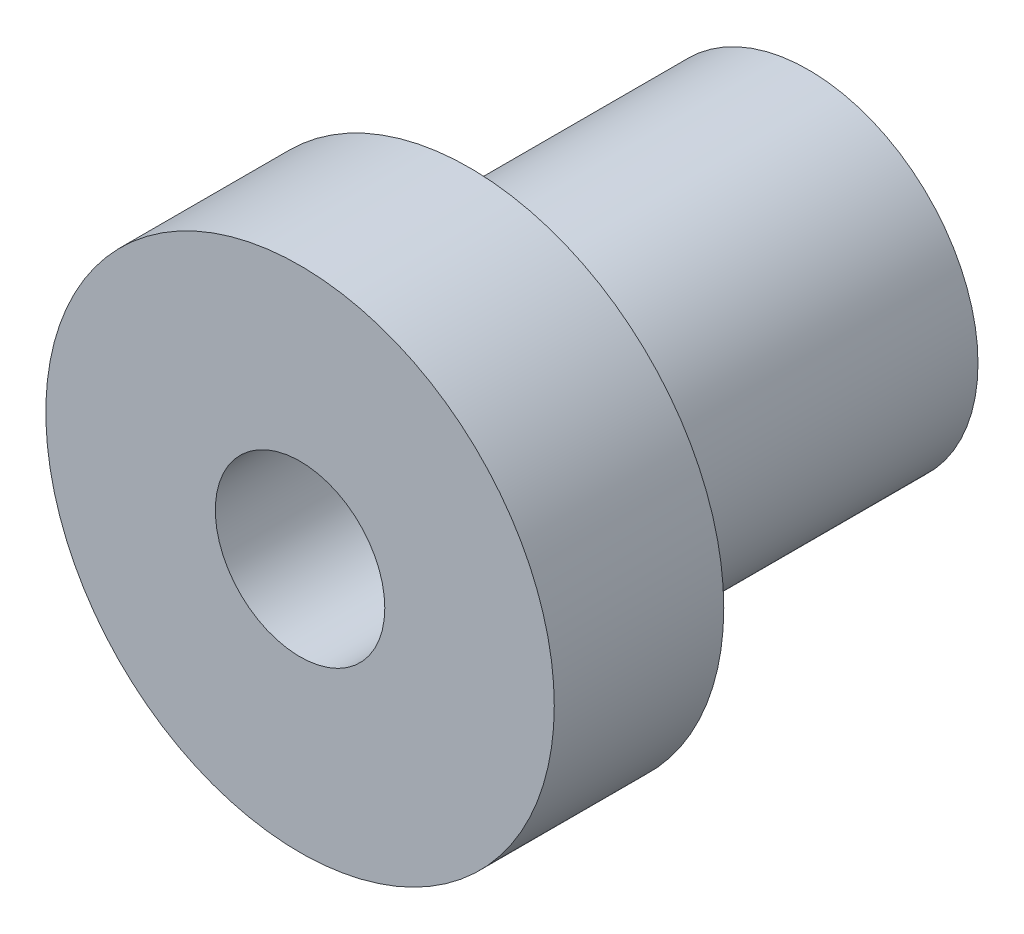
ISO-10303-21;
HEADER;
FILE_DESCRIPTION(('STEP AP214'),'2;1');
FILE_NAME('part.step','',(''),(''),'','','');
FILE_SCHEMA(('AUTOMOTIVE_DESIGN { 1 0 10303 214 1 1 1 1 }'));
ENDSEC;
DATA;
#1=APPLICATION_CONTEXT('core data for automotive mechanical design processes');
#2=APPLICATION_PROTOCOL_DEFINITION('international standard','automotive_design',2000,#1);
#3=PRODUCT_CONTEXT('',#1,'mechanical');
#4=PRODUCT('Part','Part','',(#3));
#5=PRODUCT_RELATED_PRODUCT_CATEGORY('part','',(#4));
#6=PRODUCT_DEFINITION_FORMATION('','',#4);
#7=PRODUCT_DEFINITION_CONTEXT('part definition',#1,'design');
#8=PRODUCT_DEFINITION('design','',#6,#7);
#9=PRODUCT_DEFINITION_SHAPE('','',#8);
#10=(LENGTH_UNIT() NAMED_UNIT(*) SI_UNIT(.MILLI.,.METRE.));
#11=(NAMED_UNIT(*) PLANE_ANGLE_UNIT() SI_UNIT($,.RADIAN.));
#12=(NAMED_UNIT(*) SI_UNIT($,.STERADIAN.) SOLID_ANGLE_UNIT());
#13=UNCERTAINTY_MEASURE_WITH_UNIT(LENGTH_MEASURE(1.E-05),#10,'distance_accuracy_value','');
#14=(GEOMETRIC_REPRESENTATION_CONTEXT(3) GLOBAL_UNCERTAINTY_ASSIGNED_CONTEXT((#13)) GLOBAL_UNIT_ASSIGNED_CONTEXT((#10,
#11,#12)) REPRESENTATION_CONTEXT('',''));
#15=CARTESIAN_POINT('',(0.,0.,0.));
#16=DIRECTION('',(0.,0.,1.));
#17=DIRECTION('',(1.,0.,0.));
#18=AXIS2_PLACEMENT_3D('',#15,#16,#17);
#19=CARTESIAN_POINT('',(0.,4.7625,3.175));
#20=DIRECTION('',(0.,0.,-1.));
#21=DIRECTION('',(-1.,0.,0.));
#22=AXIS2_PLACEMENT_3D('',#19,#20,#21);
#23=PLANE('',#22);
#24=CARTESIAN_POINT('',(0.,0.,3.175));
#25=DIRECTION('',(0.,0.,1.));
#26=DIRECTION('',(1.,0.,0.));
#27=AXIS2_PLACEMENT_3D('',#24,#25,#26);
#28=CIRCLE('',#27,1.5875);
#29=CARTESIAN_POINT('',(1.5875,0.,3.175));
#30=VERTEX_POINT('',#29);
#31=EDGE_CURVE('E10',#30,#30,#28,.T.);
#32=ORIENTED_EDGE('',*,*,#31,.F.);
#33=EDGE_LOOP('',(#32));
#34=FACE_BOUND('',#33,.T.);
#35=CARTESIAN_POINT('',(0.,0.,3.175));
#36=DIRECTION('',(0.,0.,1.));
#37=DIRECTION('',(1.,0.,0.));
#38=AXIS2_PLACEMENT_3D('',#35,#36,#37);
#39=CIRCLE('',#38,4.7625);
#40=CARTESIAN_POINT('',(4.7625,0.,3.175));
#41=VERTEX_POINT('',#40);
#42=EDGE_CURVE('E52',#41,#41,#39,.T.);
#43=ORIENTED_EDGE('',*,*,#42,.T.);
#44=EDGE_LOOP('',(#43));
#45=FACE_BOUND('',#44,.T.);
#46=ADVANCED_FACE('F30',(#34,#45),#23,.F.);
#47=CARTESIAN_POINT('',(0.,0.,3.175));
#48=DIRECTION('',(0.,0.,1.));
#49=DIRECTION('',(1.,0.,0.));
#50=AXIS2_PLACEMENT_3D('',#47,#48,#49);
#51=CYLINDRICAL_SURFACE('',#50,1.5875);
#52=CARTESIAN_POINT('',(0.,0.,-6.35));
#53=DIRECTION('',(0.,0.,1.));
#54=DIRECTION('',(1.,0.,0.));
#55=AXIS2_PLACEMENT_3D('',#52,#53,#54);
#56=CIRCLE('',#55,1.5875);
#57=CARTESIAN_POINT('',(1.5875,0.,-6.35));
#58=VERTEX_POINT('',#57);
#59=EDGE_CURVE('E36',#58,#58,#56,.T.);
#60=ORIENTED_EDGE('',*,*,#59,.F.);
#61=EDGE_LOOP('',(#60));
#62=FACE_BOUND('',#61,.T.);
#63=ORIENTED_EDGE('',*,*,#31,.T.);
#64=EDGE_LOOP('',(#63));
#65=FACE_BOUND('',#64,.T.);
#66=ADVANCED_FACE('F77',(#62,#65),#51,.F.);
#67=CARTESIAN_POINT('',(0.,1.5875,-6.35));
#68=DIRECTION('',(0.,0.,1.));
#69=DIRECTION('',(1.,0.,0.));
#70=AXIS2_PLACEMENT_3D('',#67,#68,#69);
#71=PLANE('',#70);
#72=CARTESIAN_POINT('',(0.,0.,-6.35));
#73=DIRECTION('',(0.,0.,1.));
#74=DIRECTION('',(1.,0.,0.));
#75=AXIS2_PLACEMENT_3D('',#72,#73,#74);
#76=CIRCLE('',#75,3.175);
#77=CARTESIAN_POINT('',(3.175,0.,-6.35));
#78=VERTEX_POINT('',#77);
#79=EDGE_CURVE('E40',#78,#78,#76,.T.);
#80=ORIENTED_EDGE('',*,*,#79,.F.);
#81=EDGE_LOOP('',(#80));
#82=FACE_BOUND('',#81,.T.);
#83=ORIENTED_EDGE('',*,*,#59,.T.);
#84=EDGE_LOOP('',(#83));
#85=FACE_BOUND('',#84,.T.);
#86=ADVANCED_FACE('F72',(#82,#85),#71,.F.);
#87=CARTESIAN_POINT('',(0.,0.,3.175));
#88=DIRECTION('',(0.,0.,1.));
#89=DIRECTION('',(1.,0.,0.));
#90=AXIS2_PLACEMENT_3D('',#87,#88,#89);
#91=CYLINDRICAL_SURFACE('',#90,3.175);
#92=CARTESIAN_POINT('',(0.,0.,0.));
#93=DIRECTION('',(0.,0.,1.));
#94=DIRECTION('',(1.,0.,0.));
#95=AXIS2_PLACEMENT_3D('',#92,#93,#94);
#96=CIRCLE('',#95,3.175);
#97=CARTESIAN_POINT('',(3.175,0.,0.));
#98=VERTEX_POINT('',#97);
#99=EDGE_CURVE('E44',#98,#98,#96,.T.);
#100=ORIENTED_EDGE('',*,*,#99,.F.);
#101=EDGE_LOOP('',(#100));
#102=FACE_BOUND('',#101,.T.);
#103=ORIENTED_EDGE('',*,*,#79,.T.);
#104=EDGE_LOOP('',(#103));
#105=FACE_BOUND('',#104,.T.);
#106=ADVANCED_FACE('F66',(#102,#105),#91,.T.);
#107=CARTESIAN_POINT('',(0.,3.175,0.));
#108=DIRECTION('',(0.,0.,1.));
#109=DIRECTION('',(1.,0.,0.));
#110=AXIS2_PLACEMENT_3D('',#107,#108,#109);
#111=PLANE('',#110);
#112=CARTESIAN_POINT('',(0.,0.,0.));
#113=DIRECTION('',(0.,0.,1.));
#114=DIRECTION('',(1.,0.,0.));
#115=AXIS2_PLACEMENT_3D('',#112,#113,#114);
#116=CIRCLE('',#115,4.7625);
#117=CARTESIAN_POINT('',(4.7625,0.,0.));
#118=VERTEX_POINT('',#117);
#119=EDGE_CURVE('E49',#118,#118,#116,.T.);
#120=ORIENTED_EDGE('',*,*,#119,.F.);
#121=EDGE_LOOP('',(#120));
#122=FACE_BOUND('',#121,.T.);
#123=ORIENTED_EDGE('',*,*,#99,.T.);
#124=EDGE_LOOP('',(#123));
#125=FACE_BOUND('',#124,.T.);
#126=ADVANCED_FACE('F60',(#122,#125),#111,.F.);
#127=CARTESIAN_POINT('',(0.,0.,3.175));
#128=DIRECTION('',(0.,0.,1.));
#129=DIRECTION('',(1.,0.,0.));
#130=AXIS2_PLACEMENT_3D('',#127,#128,#129);
#131=CYLINDRICAL_SURFACE('',#130,4.7625);
#132=ORIENTED_EDGE('',*,*,#42,.F.);
#133=EDGE_LOOP('',(#132));
#134=FACE_BOUND('',#133,.T.);
#135=ORIENTED_EDGE('',*,*,#119,.T.);
#136=EDGE_LOOP('',(#135));
#137=FACE_BOUND('',#136,.T.);
#138=ADVANCED_FACE('F57',(#134,#137),#131,.T.);
#139=CLOSED_SHELL('',(#46,#66,#86,#106,#126,#138));
#140=MANIFOLD_SOLID_BREP('B2',#139);
#141=ADVANCED_BREP_SHAPE_REPRESENTATION('',(#18,#140),#14);
#142=SHAPE_DEFINITION_REPRESENTATION(#9,#141);
ENDSEC;
END-ISO-10303-21;
